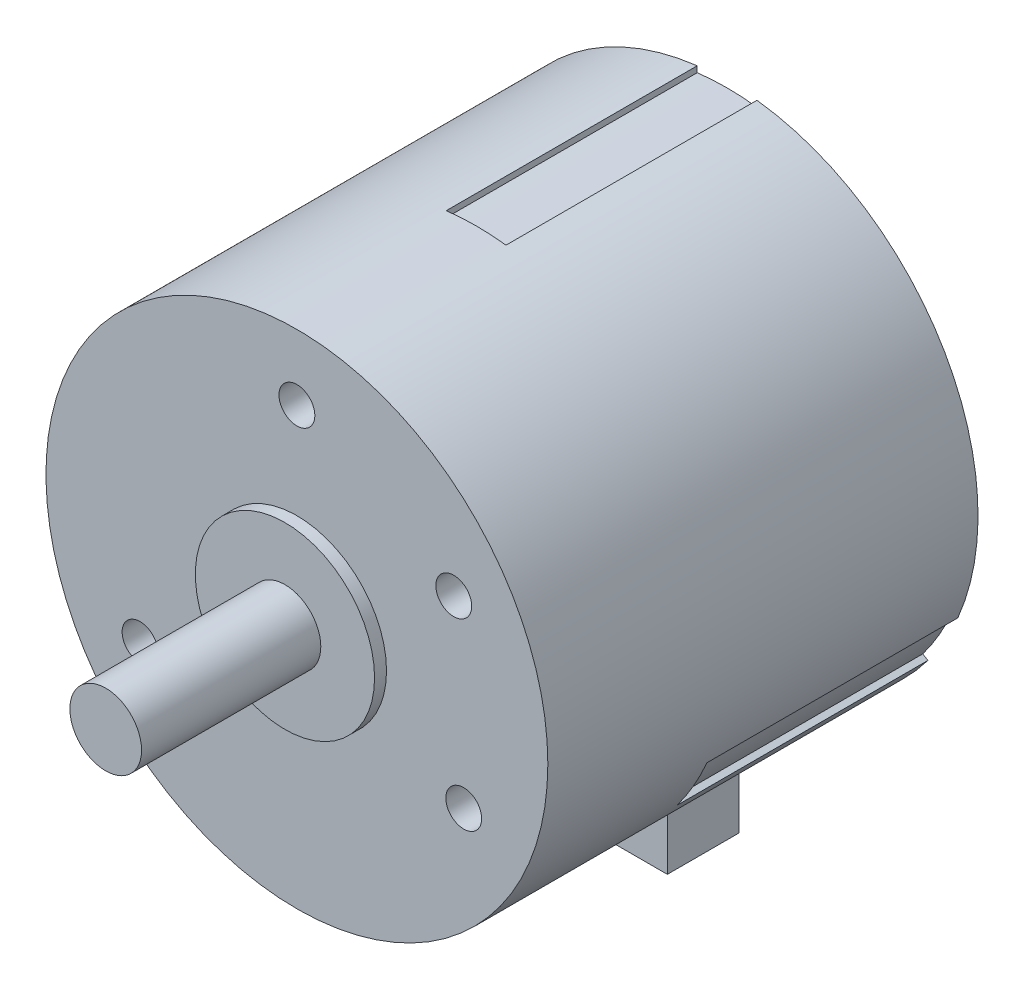
ISO-10303-21;
HEADER;
FILE_DESCRIPTION(('STEP AP214'),'2;1');
FILE_NAME('part.step','',(''),(''),'','','');
FILE_SCHEMA(('AUTOMOTIVE_DESIGN { 1 0 10303 214 1 1 1 1 }'));
ENDSEC;
DATA;
#1=APPLICATION_CONTEXT('core data for automotive mechanical design processes');
#2=APPLICATION_PROTOCOL_DEFINITION('international standard','automotive_design',2000,#1);
#3=PRODUCT_CONTEXT('',#1,'mechanical');
#4=PRODUCT('Part','Part','',(#3));
#5=PRODUCT_RELATED_PRODUCT_CATEGORY('part','',(#4));
#6=PRODUCT_DEFINITION_FORMATION('','',#4);
#7=PRODUCT_DEFINITION_CONTEXT('part definition',#1,'design');
#8=PRODUCT_DEFINITION('design','',#6,#7);
#9=PRODUCT_DEFINITION_SHAPE('','',#8);
#10=(LENGTH_UNIT() NAMED_UNIT(*) SI_UNIT(.MILLI.,.METRE.));
#11=(NAMED_UNIT(*) PLANE_ANGLE_UNIT() SI_UNIT($,.RADIAN.));
#12=(NAMED_UNIT(*) SI_UNIT($,.STERADIAN.) SOLID_ANGLE_UNIT());
#13=UNCERTAINTY_MEASURE_WITH_UNIT(LENGTH_MEASURE(1.E-05),#10,'distance_accuracy_value','');
#14=(GEOMETRIC_REPRESENTATION_CONTEXT(3) GLOBAL_UNCERTAINTY_ASSIGNED_CONTEXT((#13)) GLOBAL_UNIT_ASSIGNED_CONTEXT((#10,
#11,#12)) REPRESENTATION_CONTEXT('',''));
#15=CARTESIAN_POINT('',(0.,0.,0.));
#16=DIRECTION('',(0.,0.,1.));
#17=DIRECTION('',(1.,0.,0.));
#18=AXIS2_PLACEMENT_3D('',#15,#16,#17);
#19=CARTESIAN_POINT('',(0.,0.,0.));
#20=DIRECTION('',(0.,0.,1.));
#21=DIRECTION('',(1.,0.,0.));
#22=AXIS2_PLACEMENT_3D('',#19,#20,#21);
#23=PLANE('',#22);
#24=DIRECTION('',(-0.866025403784439,-0.499999999999999,0.));
#25=VECTOR('',#24,1.);
#26=CARTESIAN_POINT('',(-19.3072007797444,-8.26026622153542,0.));
#27=LINE('',#26,#25);
#28=CARTESIAN_POINT('',(-18.8710101867061,-8.00843146522681,0.));
#29=VERTEX_POINT('',#28);
#30=CARTESIAN_POINT('',(-19.3072007797444,-8.26026622153542,0.));
#31=VERTEX_POINT('',#30);
#32=EDGE_CURVE('E285',#29,#31,#27,.T.);
#33=ORIENTED_EDGE('',*,*,#32,.F.);
#34=CARTESIAN_POINT('',(0.,0.,0.));
#35=DIRECTION('',(0.,0.,-1.));
#36=DIRECTION('',(-1.,0.,0.));
#37=AXIS2_PLACEMENT_3D('',#34,#35,#36);
#38=CIRCLE('',#37,20.5);
#39=CARTESIAN_POINT('',(-16.3710101867061,-12.338558484149,0.));
#40=VERTEX_POINT('',#39);
#41=EDGE_CURVE('E314',#40,#29,#38,.T.);
#42=ORIENTED_EDGE('',*,*,#41,.F.);
#43=DIRECTION('',(0.866025403784439,0.499999999999999,0.));
#44=VECTOR('',#43,1.);
#45=CARTESIAN_POINT('',(-16.8072007797444,-12.5903932404576,0.));
#46=LINE('',#45,#44);
#47=CARTESIAN_POINT('',(-16.8072007797444,-12.5903932404576,0.));
#48=VERTEX_POINT('',#47);
#49=EDGE_CURVE('E311',#48,#40,#46,.T.);
#50=ORIENTED_EDGE('',*,*,#49,.F.);
#51=CARTESIAN_POINT('',(0.,0.,0.));
#52=DIRECTION('',(0.,0.,1.));
#53=DIRECTION('',(1.,0.,0.));
#54=AXIS2_PLACEMENT_3D('',#51,#52,#53);
#55=CIRCLE('',#54,21.);
#56=EDGE_CURVE('E362',#31,#48,#55,.T.);
#57=ORIENTED_EDGE('',*,*,#56,.F.);
#58=EDGE_LOOP('',(#33,#42,#50,#57));
#59=FACE_BOUND('',#58,.T.);
#60=ADVANCED_FACE('F35',(#59),#23,.F.);
#61=DIRECTION('',(0.,-1.,0.));
#62=VECTOR('',#61,1.);
#63=CARTESIAN_POINT('',(-15.,-13.9731886124821,0.));
#64=LINE('',#63,#62);
#65=CARTESIAN_POINT('',(-15.,-13.9731886124821,0.));
#66=VERTEX_POINT('',#65);
#67=CARTESIAN_POINT('',(-15.,-14.6969384566991,0.));
#68=VERTEX_POINT('',#67);
#69=EDGE_CURVE('E308',#66,#68,#64,.T.);
#70=ORIENTED_EDGE('',*,*,#69,.F.);
#71=CARTESIAN_POINT('',(0.,0.,0.));
#72=DIRECTION('',(0.,0.,-1.));
#73=DIRECTION('',(-1.,0.,0.));
#74=AXIS2_PLACEMENT_3D('',#71,#72,#73);
#75=CIRCLE('',#74,20.5);
#76=CARTESIAN_POINT('',(15.,-13.9731886124821,0.));
#77=VERTEX_POINT('',#76);
#78=EDGE_CURVE('E305',#77,#66,#75,.T.);
#79=ORIENTED_EDGE('',*,*,#78,.F.);
#80=DIRECTION('',(0.,1.,0.));
#81=VECTOR('',#80,1.);
#82=CARTESIAN_POINT('',(15.,-13.9731886124821,0.));
#83=LINE('',#82,#81);
#84=CARTESIAN_POINT('',(15.,-14.6969384566991,0.));
#85=VERTEX_POINT('',#84);
#86=EDGE_CURVE('E302',#85,#77,#83,.T.);
#87=ORIENTED_EDGE('',*,*,#86,.F.);
#88=EDGE_CURVE('E364',#68,#85,#55,.T.);
#89=ORIENTED_EDGE('',*,*,#88,.F.);
#90=EDGE_LOOP('',(#70,#79,#87,#89));
#91=FACE_BOUND('',#90,.T.);
#92=ADVANCED_FACE('F385',(#91),#23,.F.);
#93=DIRECTION('',(0.866025403784441,-0.499999999999997,0.));
#94=VECTOR('',#93,1.);
#95=CARTESIAN_POINT('',(16.8072007797443,-12.5903932404576,0.));
#96=LINE('',#95,#94);
#97=CARTESIAN_POINT('',(16.3710101867061,-12.338558484149,0.));
#98=VERTEX_POINT('',#97);
#99=CARTESIAN_POINT('',(16.8072007797443,-12.5903932404576,0.));
#100=VERTEX_POINT('',#99);
#101=EDGE_CURVE('E299',#98,#100,#96,.T.);
#102=ORIENTED_EDGE('',*,*,#101,.F.);
#103=CARTESIAN_POINT('',(0.,0.,0.));
#104=DIRECTION('',(0.,0.,-1.));
#105=DIRECTION('',(-1.,0.,0.));
#106=AXIS2_PLACEMENT_3D('',#103,#104,#105);
#107=CIRCLE('',#106,20.5);
#108=CARTESIAN_POINT('',(18.8710101867061,-8.00843146522682,0.));
#109=VERTEX_POINT('',#108);
#110=EDGE_CURVE('E296',#109,#98,#107,.T.);
#111=ORIENTED_EDGE('',*,*,#110,.F.);
#112=DIRECTION('',(-0.866025403784438,0.500000000000002,0.));
#113=VECTOR('',#112,1.);
#114=CARTESIAN_POINT('',(19.3072007797443,-8.26026622153543,0.));
#115=LINE('',#114,#113);
#116=CARTESIAN_POINT('',(19.3072007797443,-8.26026622153543,0.));
#117=VERTEX_POINT('',#116);
#118=EDGE_CURVE('E293',#117,#109,#115,.T.);
#119=ORIENTED_EDGE('',*,*,#118,.F.);
#120=EDGE_CURVE('E190',#100,#117,#55,.T.);
#121=ORIENTED_EDGE('',*,*,#120,.F.);
#122=EDGE_LOOP('',(#102,#111,#119,#121));
#123=FACE_BOUND('',#122,.T.);
#124=ADVANCED_FACE('F415',(#123),#23,.F.);
#125=DIRECTION('',(0.,1.,0.));
#126=VECTOR('',#125,1.);
#127=CARTESIAN_POINT('',(2.5,20.850659461993,0.));
#128=LINE('',#127,#126);
#129=CARTESIAN_POINT('',(2.5,20.3469899493758,0.));
#130=VERTEX_POINT('',#129);
#131=CARTESIAN_POINT('',(2.5,20.850659461993,0.));
#132=VERTEX_POINT('',#131);
#133=EDGE_CURVE('E290',#130,#132,#128,.T.);
#134=ORIENTED_EDGE('',*,*,#133,.F.);
#135=CARTESIAN_POINT('',(0.,0.,0.));
#136=DIRECTION('',(0.,0.,-1.));
#137=DIRECTION('',(-1.,0.,0.));
#138=AXIS2_PLACEMENT_3D('',#135,#136,#137);
#139=CIRCLE('',#138,20.5);
#140=CARTESIAN_POINT('',(-2.5,20.3469899493758,0.));
#141=VERTEX_POINT('',#140);
#142=EDGE_CURVE('E287',#141,#130,#139,.T.);
#143=ORIENTED_EDGE('',*,*,#142,.F.);
#144=DIRECTION('',(0.,-1.,0.));
#145=VECTOR('',#144,1.);
#146=CARTESIAN_POINT('',(-2.5,20.850659461993,0.));
#147=LINE('',#146,#145);
#148=CARTESIAN_POINT('',(-2.5,20.850659461993,0.));
#149=VERTEX_POINT('',#148);
#150=EDGE_CURVE('E281',#149,#141,#147,.T.);
#151=ORIENTED_EDGE('',*,*,#150,.F.);
#152=EDGE_CURVE('E39',#132,#149,#55,.T.);
#153=ORIENTED_EDGE('',*,*,#152,.F.);
#154=EDGE_LOOP('',(#134,#143,#151,#153));
#155=FACE_BOUND('',#154,.T.);
#156=ADVANCED_FACE('F411',(#155),#23,.F.);
#157=CARTESIAN_POINT('',(0.,0.,15.));
#158=DIRECTION('',(0.,0.,-1.));
#159=DIRECTION('',(-1.,0.,0.));
#160=AXIS2_PLACEMENT_3D('',#157,#158,#159);
#161=CYLINDRICAL_SURFACE('',#160,21.);
#162=DIRECTION('',(0.,0.,1.));
#163=VECTOR('',#162,1.);
#164=CARTESIAN_POINT('',(15.,-14.6969384566991,-6.));
#165=LINE('',#164,#163);
#166=CARTESIAN_POINT('',(15.,-14.6969384566991,-12.));
#167=VERTEX_POINT('',#166);
#168=EDGE_CURVE('E338',#167,#85,#165,.T.);
#169=ORIENTED_EDGE('',*,*,#168,.F.);
#170=CARTESIAN_POINT('',(0.,0.,-12.));
#171=DIRECTION('',(0.,0.,-1.));
#172=DIRECTION('',(-1.,0.,0.));
#173=AXIS2_PLACEMENT_3D('',#170,#171,#172);
#174=CIRCLE('',#173,21.);
#175=CARTESIAN_POINT('',(10.,-18.4661853126194,-12.));
#176=VERTEX_POINT('',#175);
#177=EDGE_CURVE('E207',#167,#176,#174,.T.);
#178=ORIENTED_EDGE('',*,*,#177,.T.);
#179=CARTESIAN_POINT('',(-10.,-18.4661853126194,-12.));
#180=VERTEX_POINT('',#179);
#181=EDGE_CURVE('E59',#176,#180,#174,.T.);
#182=ORIENTED_EDGE('',*,*,#181,.T.);
#183=CARTESIAN_POINT('',(-15.,-14.6969384566991,-12.));
#184=VERTEX_POINT('',#183);
#185=EDGE_CURVE('E210',#180,#184,#174,.T.);
#186=ORIENTED_EDGE('',*,*,#185,.T.);
#187=DIRECTION('',(0.,0.,1.));
#188=VECTOR('',#187,1.);
#189=CARTESIAN_POINT('',(-15.,-14.6969384566991,-6.));
#190=LINE('',#189,#188);
#191=EDGE_CURVE('E329',#184,#68,#190,.T.);
#192=ORIENTED_EDGE('',*,*,#191,.T.);
#193=ORIENTED_EDGE('',*,*,#88,.T.);
#194=EDGE_LOOP('',(#169,#178,#182,#186,#192,#193));
#195=FACE_BOUND('',#194,.T.);
#196=CARTESIAN_POINT('',(0.,0.,15.));
#197=DIRECTION('',(0.,0.,1.));
#198=DIRECTION('',(1.,0.,0.));
#199=AXIS2_PLACEMENT_3D('',#196,#197,#198);
#200=CIRCLE('',#199,21.);
#201=CARTESIAN_POINT('',(21.,0.,15.));
#202=VERTEX_POINT('',#201);
#203=EDGE_CURVE('E358',#202,#202,#200,.T.);
#204=ORIENTED_EDGE('',*,*,#203,.F.);
#205=EDGE_LOOP('',(#204));
#206=FACE_BOUND('',#205,.T.);
#207=ORIENTED_EDGE('',*,*,#152,.T.);
#208=DIRECTION('',(0.,0.,1.));
#209=VECTOR('',#208,1.);
#210=CARTESIAN_POINT('',(-2.5,20.850659461993,-6.));
#211=LINE('',#210,#209);
#212=CARTESIAN_POINT('',(-2.5,20.850659461993,-21.));
#213=VERTEX_POINT('',#212);
#214=EDGE_CURVE('E182',#213,#149,#211,.T.);
#215=ORIENTED_EDGE('',*,*,#214,.F.);
#216=CARTESIAN_POINT('',(0.,0.,-21.));
#217=DIRECTION('',(0.,0.,-1.));
#218=DIRECTION('',(-1.,0.,0.));
#219=AXIS2_PLACEMENT_3D('',#216,#217,#218);
#220=CIRCLE('',#219,21.);
#221=CARTESIAN_POINT('',(-19.3072007797444,-8.26026622153542,-21.));
#222=VERTEX_POINT('',#221);
#223=EDGE_CURVE('E186',#222,#213,#220,.T.);
#224=ORIENTED_EDGE('',*,*,#223,.F.);
#225=DIRECTION('',(0.,0.,1.));
#226=VECTOR('',#225,1.);
#227=CARTESIAN_POINT('',(-19.3072007797444,-8.26026622153542,-6.));
#228=LINE('',#227,#226);
#229=EDGE_CURVE('E284',#222,#31,#228,.T.);
#230=ORIENTED_EDGE('',*,*,#229,.T.);
#231=ORIENTED_EDGE('',*,*,#56,.T.);
#232=DIRECTION('',(0.,0.,1.));
#233=VECTOR('',#232,1.);
#234=CARTESIAN_POINT('',(-16.8072007797444,-12.5903932404576,-6.));
#235=LINE('',#234,#233);
#236=CARTESIAN_POINT('',(-16.8072007797444,-12.5903932404576,-21.));
#237=VERTEX_POINT('',#236);
#238=EDGE_CURVE('E326',#237,#48,#235,.T.);
#239=ORIENTED_EDGE('',*,*,#238,.F.);
#240=CARTESIAN_POINT('',(0.,0.,-21.));
#241=DIRECTION('',(0.,0.,-1.));
#242=DIRECTION('',(-1.,0.,0.));
#243=AXIS2_PLACEMENT_3D('',#240,#241,#242);
#244=CIRCLE('',#243,21.);
#245=CARTESIAN_POINT('',(16.8072007797443,-12.5903932404576,-21.));
#246=VERTEX_POINT('',#245);
#247=EDGE_CURVE('E231',#246,#237,#244,.T.);
#248=ORIENTED_EDGE('',*,*,#247,.F.);
#249=DIRECTION('',(0.,0.,1.));
#250=VECTOR('',#249,1.);
#251=CARTESIAN_POINT('',(16.8072007797443,-12.5903932404576,-6.));
#252=LINE('',#251,#250);
#253=EDGE_CURVE('E341',#246,#100,#252,.T.);
#254=ORIENTED_EDGE('',*,*,#253,.T.);
#255=ORIENTED_EDGE('',*,*,#120,.T.);
#256=DIRECTION('',(0.,0.,1.));
#257=VECTOR('',#256,1.);
#258=CARTESIAN_POINT('',(19.3072007797444,-8.26026622153543,-6.));
#259=LINE('',#258,#257);
#260=CARTESIAN_POINT('',(19.3072007797444,-8.26026622153543,-21.));
#261=VERTEX_POINT('',#260);
#262=EDGE_CURVE('E350',#261,#117,#259,.T.);
#263=ORIENTED_EDGE('',*,*,#262,.F.);
#264=CARTESIAN_POINT('',(0.,0.,-21.));
#265=DIRECTION('',(0.,0.,-1.));
#266=DIRECTION('',(-1.,0.,0.));
#267=AXIS2_PLACEMENT_3D('',#264,#265,#266);
#268=CIRCLE('',#267,21.);
#269=CARTESIAN_POINT('',(2.5,20.850659461993,-21.));
#270=VERTEX_POINT('',#269);
#271=EDGE_CURVE('E219',#270,#261,#268,.T.);
#272=ORIENTED_EDGE('',*,*,#271,.F.);
#273=DIRECTION('',(0.,0.,1.));
#274=VECTOR('',#273,1.);
#275=CARTESIAN_POINT('',(2.5,20.850659461993,-6.));
#276=LINE('',#275,#274);
#277=EDGE_CURVE('E353',#270,#132,#276,.T.);
#278=ORIENTED_EDGE('',*,*,#277,.T.);
#279=EDGE_LOOP('',(#207,#215,#224,#230,#231,#239,#248,#254,#255,#263,#272,#278));
#280=FACE_BOUND('',#279,.T.);
#281=ADVANCED_FACE('F37',(#195,#206,#280),#161,.T.);
#282=CARTESIAN_POINT('',(0.,0.,15.));
#283=DIRECTION('',(0.,0.,1.));
#284=DIRECTION('',(1.,0.,0.));
#285=AXIS2_PLACEMENT_3D('',#282,#283,#284);
#286=PLANE('',#285);
#287=CARTESIAN_POINT('',(0.,15.5,15.));
#288=DIRECTION('',(0.,0.,1.));
#289=DIRECTION('',(1.,0.,0.));
#290=AXIS2_PLACEMENT_3D('',#287,#288,#289);
#291=CIRCLE('',#290,1.5);
#292=CARTESIAN_POINT('',(1.5,15.5,15.));
#293=VERTEX_POINT('',#292);
#294=EDGE_CURVE('E486',#293,#293,#291,.T.);
#295=ORIENTED_EDGE('',*,*,#294,.F.);
#296=EDGE_LOOP('',(#295));
#297=FACE_BOUND('',#296,.T.);
#298=CARTESIAN_POINT('',(13.1270902899199,8.24193548387097,15.));
#299=DIRECTION('',(0.,0.,1.));
#300=DIRECTION('',(1.,0.,0.));
#301=AXIS2_PLACEMENT_3D('',#298,#299,#300);
#302=CIRCLE('',#301,1.5);
#303=CARTESIAN_POINT('',(14.6270902899199,8.24193548387097,15.));
#304=VERTEX_POINT('',#303);
#305=EDGE_CURVE('E490',#304,#304,#302,.T.);
#306=ORIENTED_EDGE('',*,*,#305,.F.);
#307=EDGE_LOOP('',(#306));
#308=FACE_BOUND('',#307,.T.);
#309=CARTESIAN_POINT('',(13.9603395174798,-6.73490315867208,15.));
#310=DIRECTION('',(0.,0.,1.));
#311=DIRECTION('',(1.,0.,0.));
#312=AXIS2_PLACEMENT_3D('',#309,#310,#311);
#313=CIRCLE('',#312,1.5);
#314=CARTESIAN_POINT('',(15.4603395174798,-6.73490315867208,15.));
#315=VERTEX_POINT('',#314);
#316=EDGE_CURVE('E494',#315,#315,#313,.T.);
#317=ORIENTED_EDGE('',*,*,#316,.F.);
#318=EDGE_LOOP('',(#317));
#319=FACE_BOUND('',#318,.T.);
#320=CARTESIAN_POINT('',(-13.1270902899198,-8.24193548387083,15.));
#321=DIRECTION('',(0.,0.,1.));
#322=DIRECTION('',(1.,0.,0.));
#323=AXIS2_PLACEMENT_3D('',#320,#321,#322);
#324=CIRCLE('',#323,1.5);
#325=CARTESIAN_POINT('',(-11.6270902899198,-8.24193548387083,15.));
#326=VERTEX_POINT('',#325);
#327=EDGE_CURVE('E498',#326,#326,#324,.T.);
#328=ORIENTED_EDGE('',*,*,#327,.F.);
#329=EDGE_LOOP('',(#328));
#330=FACE_BOUND('',#329,.T.);
#331=CARTESIAN_POINT('',(0.,0.,15.));
#332=DIRECTION('',(0.,0.,1.));
#333=DIRECTION('',(1.,0.,0.));
#334=AXIS2_PLACEMENT_3D('',#331,#332,#333);
#335=CIRCLE('',#334,7.5);
#336=CARTESIAN_POINT('',(7.5,0.,15.));
#337=VERTEX_POINT('',#336);
#338=EDGE_CURVE('E44',#337,#337,#335,.T.);
#339=ORIENTED_EDGE('',*,*,#338,.F.);
#340=EDGE_LOOP('',(#339));
#341=FACE_BOUND('',#340,.T.);
#342=ORIENTED_EDGE('',*,*,#203,.T.);
#343=EDGE_LOOP('',(#342));
#344=FACE_BOUND('',#343,.T.);
#345=ADVANCED_FACE('F423',(#297,#308,#319,#330,#341,#344),#286,.T.);
#346=CARTESIAN_POINT('',(-2.5,20.850659461993,-6.));
#347=DIRECTION('',(-1.,0.,0.));
#348=DIRECTION('',(0.,0.,1.));
#349=AXIS2_PLACEMENT_3D('',#346,#347,#348);
#350=PLANE('',#349);
#351=ORIENTED_EDGE('',*,*,#150,.T.);
#352=DIRECTION('',(0.,0.,1.));
#353=VECTOR('',#352,1.);
#354=CARTESIAN_POINT('',(-2.5,20.3469899493758,-6.));
#355=LINE('',#354,#353);
#356=CARTESIAN_POINT('',(-2.5,20.3469899493758,-21.));
#357=VERTEX_POINT('',#356);
#358=EDGE_CURVE('E191',#357,#141,#355,.T.);
#359=ORIENTED_EDGE('',*,*,#358,.F.);
#360=DIRECTION('',(0.,-1.,0.));
#361=VECTOR('',#360,1.);
#362=CARTESIAN_POINT('',(-2.5,20.850659461993,-21.));
#363=LINE('',#362,#361);
#364=EDGE_CURVE('E194',#213,#357,#363,.T.);
#365=ORIENTED_EDGE('',*,*,#364,.F.);
#366=ORIENTED_EDGE('',*,*,#214,.T.);
#367=EDGE_LOOP('',(#351,#359,#365,#366));
#368=FACE_BOUND('',#367,.T.);
#369=ADVANCED_FACE('F195',(#368),#350,.F.);
#370=CARTESIAN_POINT('',(0.,0.,-6.));
#371=DIRECTION('',(0.,0.,1.));
#372=DIRECTION('',(1.,0.,0.));
#373=AXIS2_PLACEMENT_3D('',#370,#371,#372);
#374=CYLINDRICAL_SURFACE('',#373,20.5);
#375=ORIENTED_EDGE('',*,*,#142,.T.);
#376=DIRECTION('',(0.,0.,1.));
#377=VECTOR('',#376,1.);
#378=CARTESIAN_POINT('',(2.5,20.3469899493758,-6.));
#379=LINE('',#378,#377);
#380=CARTESIAN_POINT('',(2.5,20.3469899493758,-21.));
#381=VERTEX_POINT('',#380);
#382=EDGE_CURVE('E355',#381,#130,#379,.T.);
#383=ORIENTED_EDGE('',*,*,#382,.F.);
#384=CARTESIAN_POINT('',(0.,0.,-21.));
#385=DIRECTION('',(0.,0.,-1.));
#386=DIRECTION('',(-1.,0.,0.));
#387=AXIS2_PLACEMENT_3D('',#384,#385,#386);
#388=CIRCLE('',#387,20.5);
#389=EDGE_CURVE('E200',#357,#381,#388,.T.);
#390=ORIENTED_EDGE('',*,*,#389,.F.);
#391=ORIENTED_EDGE('',*,*,#358,.T.);
#392=EDGE_LOOP('',(#375,#383,#390,#391));
#393=FACE_BOUND('',#392,.T.);
#394=ADVANCED_FACE('F427',(#393),#374,.T.);
#395=CARTESIAN_POINT('',(2.5,20.850659461993,-6.));
#396=DIRECTION('',(1.,0.,0.));
#397=DIRECTION('',(0.,0.,-1.));
#398=AXIS2_PLACEMENT_3D('',#395,#396,#397);
#399=PLANE('',#398);
#400=ORIENTED_EDGE('',*,*,#133,.T.);
#401=ORIENTED_EDGE('',*,*,#277,.F.);
#402=DIRECTION('',(0.,1.,0.));
#403=VECTOR('',#402,1.);
#404=CARTESIAN_POINT('',(2.5,20.3469899493758,-21.));
#405=LINE('',#404,#403);
#406=EDGE_CURVE('E216',#381,#270,#405,.T.);
#407=ORIENTED_EDGE('',*,*,#406,.F.);
#408=ORIENTED_EDGE('',*,*,#382,.T.);
#409=EDGE_LOOP('',(#400,#401,#407,#408));
#410=FACE_BOUND('',#409,.T.);
#411=ADVANCED_FACE('F429',(#410),#399,.F.);
#412=CARTESIAN_POINT('',(19.3072007797443,-8.26026622153543,-6.));
#413=DIRECTION('',(0.500000000000002,0.866025403784438,0.));
#414=DIRECTION('',(-0.866025403784438,0.500000000000002,0.));
#415=AXIS2_PLACEMENT_3D('',#412,#413,#414);
#416=PLANE('',#415);
#417=ORIENTED_EDGE('',*,*,#118,.T.);
#418=DIRECTION('',(0.,0.,1.));
#419=VECTOR('',#418,1.);
#420=CARTESIAN_POINT('',(18.8710101867061,-8.00843146522682,-6.));
#421=LINE('',#420,#419);
#422=CARTESIAN_POINT('',(18.8710101867061,-8.0084314652268,-21.));
#423=VERTEX_POINT('',#422);
#424=EDGE_CURVE('E347',#423,#109,#421,.T.);
#425=ORIENTED_EDGE('',*,*,#424,.F.);
#426=DIRECTION('',(-0.866025403784434,0.500000000000007,0.));
#427=VECTOR('',#426,1.);
#428=CARTESIAN_POINT('',(19.3072007797444,-8.26026622153543,-21.));
#429=LINE('',#428,#427);
#430=EDGE_CURVE('E222',#261,#423,#429,.T.);
#431=ORIENTED_EDGE('',*,*,#430,.F.);
#432=ORIENTED_EDGE('',*,*,#262,.T.);
#433=EDGE_LOOP('',(#417,#425,#431,#432));
#434=FACE_BOUND('',#433,.T.);
#435=ADVANCED_FACE('F433',(#434),#416,.F.);
#436=CARTESIAN_POINT('',(0.,0.,-6.));
#437=DIRECTION('',(0.,0.,1.));
#438=DIRECTION('',(1.,0.,0.));
#439=AXIS2_PLACEMENT_3D('',#436,#437,#438);
#440=CYLINDRICAL_SURFACE('',#439,20.5);
#441=ORIENTED_EDGE('',*,*,#110,.T.);
#442=DIRECTION('',(0.,0.,1.));
#443=VECTOR('',#442,1.);
#444=CARTESIAN_POINT('',(16.3710101867061,-12.338558484149,-6.));
#445=LINE('',#444,#443);
#446=CARTESIAN_POINT('',(16.3710101867061,-12.338558484149,-21.));
#447=VERTEX_POINT('',#446);
#448=EDGE_CURVE('E344',#447,#98,#445,.T.);
#449=ORIENTED_EDGE('',*,*,#448,.F.);
#450=CARTESIAN_POINT('',(0.,0.,-21.));
#451=DIRECTION('',(0.,0.,-1.));
#452=DIRECTION('',(-1.,0.,0.));
#453=AXIS2_PLACEMENT_3D('',#450,#451,#452);
#454=CIRCLE('',#453,20.5);
#455=EDGE_CURVE('E225',#423,#447,#454,.T.);
#456=ORIENTED_EDGE('',*,*,#455,.F.);
#457=ORIENTED_EDGE('',*,*,#424,.T.);
#458=EDGE_LOOP('',(#441,#449,#456,#457));
#459=FACE_BOUND('',#458,.T.);
#460=ADVANCED_FACE('F437',(#459),#440,.T.);
#461=CARTESIAN_POINT('',(16.8072007797443,-12.5903932404576,-6.));
#462=DIRECTION('',(-0.499999999999997,-0.866025403784441,0.));
#463=DIRECTION('',(0.866025403784441,-0.499999999999997,0.));
#464=AXIS2_PLACEMENT_3D('',#461,#462,#463);
#465=PLANE('',#464);
#466=ORIENTED_EDGE('',*,*,#101,.T.);
#467=ORIENTED_EDGE('',*,*,#253,.F.);
#468=DIRECTION('',(0.866025403784439,-0.5,0.));
#469=VECTOR('',#468,1.);
#470=CARTESIAN_POINT('',(16.3710101867061,-12.338558484149,-21.));
#471=LINE('',#470,#469);
#472=EDGE_CURVE('E228',#447,#246,#471,.T.);
#473=ORIENTED_EDGE('',*,*,#472,.F.);
#474=ORIENTED_EDGE('',*,*,#448,.T.);
#475=EDGE_LOOP('',(#466,#467,#473,#474));
#476=FACE_BOUND('',#475,.T.);
#477=ADVANCED_FACE('F439',(#476),#465,.F.);
#478=CARTESIAN_POINT('',(15.,-13.9731886124821,-6.));
#479=DIRECTION('',(1.,0.,0.));
#480=DIRECTION('',(0.,0.,-1.));
#481=AXIS2_PLACEMENT_3D('',#478,#479,#480);
#482=PLANE('',#481);
#483=ORIENTED_EDGE('',*,*,#86,.T.);
#484=DIRECTION('',(0.,0.,1.));
#485=VECTOR('',#484,1.);
#486=CARTESIAN_POINT('',(15.,-13.9731886124821,-6.));
#487=LINE('',#486,#485);
#488=CARTESIAN_POINT('',(15.,-13.9731886124821,-12.));
#489=VERTEX_POINT('',#488);
#490=EDGE_CURVE('E335',#489,#77,#487,.T.);
#491=ORIENTED_EDGE('',*,*,#490,.F.);
#492=DIRECTION('',(0.,1.,0.));
#493=VECTOR('',#492,1.);
#494=CARTESIAN_POINT('',(15.,-14.6969384566991,-12.));
#495=LINE('',#494,#493);
#496=EDGE_CURVE('E243',#167,#489,#495,.T.);
#497=ORIENTED_EDGE('',*,*,#496,.F.);
#498=ORIENTED_EDGE('',*,*,#168,.T.);
#499=EDGE_LOOP('',(#483,#491,#497,#498));
#500=FACE_BOUND('',#499,.T.);
#501=ADVANCED_FACE('F372',(#500),#482,.F.);
#502=CARTESIAN_POINT('',(0.,0.,-6.));
#503=DIRECTION('',(0.,0.,1.));
#504=DIRECTION('',(1.,0.,0.));
#505=AXIS2_PLACEMENT_3D('',#502,#503,#504);
#506=CYLINDRICAL_SURFACE('',#505,20.5);
#507=ORIENTED_EDGE('',*,*,#78,.T.);
#508=DIRECTION('',(0.,0.,1.));
#509=VECTOR('',#508,1.);
#510=CARTESIAN_POINT('',(-15.,-13.9731886124821,-6.));
#511=LINE('',#510,#509);
#512=CARTESIAN_POINT('',(-15.,-13.9731886124821,-12.));
#513=VERTEX_POINT('',#512);
#514=EDGE_CURVE('E332',#513,#66,#511,.T.);
#515=ORIENTED_EDGE('',*,*,#514,.F.);
#516=CARTESIAN_POINT('',(0.,0.,-12.));
#517=DIRECTION('',(0.,0.,-1.));
#518=DIRECTION('',(-1.,0.,0.));
#519=AXIS2_PLACEMENT_3D('',#516,#517,#518);
#520=CIRCLE('',#519,20.5);
#521=CARTESIAN_POINT('',(-10.,-17.8955301681733,-12.));
#522=VERTEX_POINT('',#521);
#523=EDGE_CURVE('E258',#522,#513,#520,.T.);
#524=ORIENTED_EDGE('',*,*,#523,.F.);
#525=DIRECTION('',(0.,0.,1.));
#526=VECTOR('',#525,1.);
#527=CARTESIAN_POINT('',(-10.,-17.8955301681733,-12.));
#528=LINE('',#527,#526);
#529=CARTESIAN_POINT('',(-10.,-17.8955301681733,-6.));
#530=VERTEX_POINT('',#529);
#531=EDGE_CURVE('E264',#522,#530,#528,.T.);
#532=ORIENTED_EDGE('',*,*,#531,.T.);
#533=CARTESIAN_POINT('',(0.,0.,-6.));
#534=DIRECTION('',(0.,0.,-1.));
#535=DIRECTION('',(-1.,0.,0.));
#536=AXIS2_PLACEMENT_3D('',#533,#534,#535);
#537=CIRCLE('',#536,20.5);
#538=CARTESIAN_POINT('',(10.,-17.8955301681733,-6.));
#539=VERTEX_POINT('',#538);
#540=EDGE_CURVE('E282',#539,#530,#537,.T.);
#541=ORIENTED_EDGE('',*,*,#540,.F.);
#542=DIRECTION('',(0.,0.,1.));
#543=VECTOR('',#542,1.);
#544=CARTESIAN_POINT('',(10.,-17.8955301681733,-12.));
#545=LINE('',#544,#543);
#546=CARTESIAN_POINT('',(10.,-17.8955301681733,-12.));
#547=VERTEX_POINT('',#546);
#548=EDGE_CURVE('E278',#547,#539,#545,.T.);
#549=ORIENTED_EDGE('',*,*,#548,.F.);
#550=CARTESIAN_POINT('',(0.,0.,-12.));
#551=DIRECTION('',(0.,0.,-1.));
#552=DIRECTION('',(-1.,0.,0.));
#553=AXIS2_PLACEMENT_3D('',#550,#551,#552);
#554=CIRCLE('',#553,20.5);
#555=EDGE_CURVE('E246',#489,#547,#554,.T.);
#556=ORIENTED_EDGE('',*,*,#555,.F.);
#557=ORIENTED_EDGE('',*,*,#490,.T.);
#558=EDGE_LOOP('',(#507,#515,#524,#532,#541,#549,#556,#557));
#559=FACE_BOUND('',#558,.T.);
#560=ADVANCED_FACE('F387',(#559),#506,.T.);
#561=CARTESIAN_POINT('',(-15.,-13.9731886124821,-6.));
#562=DIRECTION('',(-1.,0.,0.));
#563=DIRECTION('',(0.,0.,1.));
#564=AXIS2_PLACEMENT_3D('',#561,#562,#563);
#565=PLANE('',#564);
#566=ORIENTED_EDGE('',*,*,#69,.T.);
#567=ORIENTED_EDGE('',*,*,#191,.F.);
#568=DIRECTION('',(0.,-1.,0.));
#569=VECTOR('',#568,1.);
#570=CARTESIAN_POINT('',(-15.,-13.9731886124821,-12.));
#571=LINE('',#570,#569);
#572=EDGE_CURVE('E261',#513,#184,#571,.T.);
#573=ORIENTED_EDGE('',*,*,#572,.F.);
#574=ORIENTED_EDGE('',*,*,#514,.T.);
#575=EDGE_LOOP('',(#566,#567,#573,#574));
#576=FACE_BOUND('',#575,.T.);
#577=ADVANCED_FACE('F384',(#576),#565,.F.);
#578=CARTESIAN_POINT('',(-16.8072007797444,-12.5903932404576,-6.));
#579=DIRECTION('',(0.499999999999999,-0.866025403784439,0.));
#580=DIRECTION('',(0.866025403784439,0.499999999999999,0.));
#581=AXIS2_PLACEMENT_3D('',#578,#579,#580);
#582=PLANE('',#581);
#583=ORIENTED_EDGE('',*,*,#49,.T.);
#584=DIRECTION('',(0.,0.,1.));
#585=VECTOR('',#584,1.);
#586=CARTESIAN_POINT('',(-16.3710101867061,-12.338558484149,-6.));
#587=LINE('',#586,#585);
#588=CARTESIAN_POINT('',(-16.3710101867061,-12.338558484149,-21.));
#589=VERTEX_POINT('',#588);
#590=EDGE_CURVE('E323',#589,#40,#587,.T.);
#591=ORIENTED_EDGE('',*,*,#590,.F.);
#592=DIRECTION('',(0.866025403784439,0.5,0.));
#593=VECTOR('',#592,1.);
#594=CARTESIAN_POINT('',(-16.8072007797444,-12.5903932404576,-21.));
#595=LINE('',#594,#593);
#596=EDGE_CURVE('E234',#237,#589,#595,.T.);
#597=ORIENTED_EDGE('',*,*,#596,.F.);
#598=ORIENTED_EDGE('',*,*,#238,.T.);
#599=EDGE_LOOP('',(#583,#591,#597,#598));
#600=FACE_BOUND('',#599,.T.);
#601=ADVANCED_FACE('F443',(#600),#582,.F.);
#602=CARTESIAN_POINT('',(0.,0.,-6.));
#603=DIRECTION('',(0.,0.,1.));
#604=DIRECTION('',(1.,0.,0.));
#605=AXIS2_PLACEMENT_3D('',#602,#603,#604);
#606=CYLINDRICAL_SURFACE('',#605,20.5);
#607=ORIENTED_EDGE('',*,*,#41,.T.);
#608=DIRECTION('',(0.,0.,1.));
#609=VECTOR('',#608,1.);
#610=CARTESIAN_POINT('',(-18.8710101867061,-8.00843146522681,-6.));
#611=LINE('',#610,#609);
#612=CARTESIAN_POINT('',(-18.8710101867061,-8.0084314652268,-21.));
#613=VERTEX_POINT('',#612);
#614=EDGE_CURVE('E320',#613,#29,#611,.T.);
#615=ORIENTED_EDGE('',*,*,#614,.F.);
#616=CARTESIAN_POINT('',(0.,0.,-21.));
#617=DIRECTION('',(0.,0.,-1.));
#618=DIRECTION('',(-1.,0.,0.));
#619=AXIS2_PLACEMENT_3D('',#616,#617,#618);
#620=CIRCLE('',#619,20.5);
#621=EDGE_CURVE('E237',#589,#613,#620,.T.);
#622=ORIENTED_EDGE('',*,*,#621,.F.);
#623=ORIENTED_EDGE('',*,*,#590,.T.);
#624=EDGE_LOOP('',(#607,#615,#622,#623));
#625=FACE_BOUND('',#624,.T.);
#626=ADVANCED_FACE('F446',(#625),#606,.T.);
#627=CARTESIAN_POINT('',(-19.3072007797444,-8.26026622153542,-6.));
#628=DIRECTION('',(-0.499999999999999,0.866025403784439,0.));
#629=DIRECTION('',(-0.866025403784439,-0.499999999999999,0.));
#630=AXIS2_PLACEMENT_3D('',#627,#628,#629);
#631=PLANE('',#630);
#632=ORIENTED_EDGE('',*,*,#32,.T.);
#633=ORIENTED_EDGE('',*,*,#229,.F.);
#634=DIRECTION('',(-0.866025403784439,-0.499999999999999,0.));
#635=VECTOR('',#634,1.);
#636=CARTESIAN_POINT('',(-18.8710101867061,-8.0084314652268,-21.));
#637=LINE('',#636,#635);
#638=EDGE_CURVE('E206',#613,#222,#637,.T.);
#639=ORIENTED_EDGE('',*,*,#638,.F.);
#640=ORIENTED_EDGE('',*,*,#614,.T.);
#641=EDGE_LOOP('',(#632,#633,#639,#640));
#642=FACE_BOUND('',#641,.T.);
#643=ADVANCED_FACE('F448',(#642),#631,.F.);
#644=CARTESIAN_POINT('',(0.,0.,-6.));
#645=DIRECTION('',(0.,0.,-1.));
#646=DIRECTION('',(-1.,0.,0.));
#647=AXIS2_PLACEMENT_3D('',#644,#645,#646);
#648=PLANE('',#647);
#649=DIRECTION('',(0.,-1.,0.));
#650=VECTOR('',#649,1.);
#651=CARTESIAN_POINT('',(10.,-17.8955301681733,-6.));
#652=LINE('',#651,#650);
#653=CARTESIAN_POINT('',(10.,-24.,-6.));
#654=VERTEX_POINT('',#653);
#655=EDGE_CURVE('E239',#539,#654,#652,.T.);
#656=ORIENTED_EDGE('',*,*,#655,.F.);
#657=ORIENTED_EDGE('',*,*,#540,.T.);
#658=DIRECTION('',(0.,1.,0.));
#659=VECTOR('',#658,1.);
#660=CARTESIAN_POINT('',(-10.,-17.8955301681733,-6.));
#661=LINE('',#660,#659);
#662=CARTESIAN_POINT('',(-10.,-24.,-6.));
#663=VERTEX_POINT('',#662);
#664=EDGE_CURVE('E247',#663,#530,#661,.T.);
#665=ORIENTED_EDGE('',*,*,#664,.F.);
#666=DIRECTION('',(-1.,0.,0.));
#667=VECTOR('',#666,1.);
#668=CARTESIAN_POINT('',(10.,-24.,-6.));
#669=LINE('',#668,#667);
#670=EDGE_CURVE('E266',#654,#663,#669,.T.);
#671=ORIENTED_EDGE('',*,*,#670,.F.);
#672=EDGE_LOOP('',(#656,#657,#665,#671));
#673=FACE_BOUND('',#672,.T.);
#674=ADVANCED_FACE('F450',(#673),#648,.F.);
#675=CARTESIAN_POINT('',(10.,-17.8955301681733,-12.));
#676=DIRECTION('',(-1.,0.,0.));
#677=DIRECTION('',(0.,0.,1.));
#678=AXIS2_PLACEMENT_3D('',#675,#676,#677);
#679=PLANE('',#678);
#680=ORIENTED_EDGE('',*,*,#655,.T.);
#681=DIRECTION('',(0.,0.,1.));
#682=VECTOR('',#681,1.);
#683=CARTESIAN_POINT('',(10.,-24.,-12.));
#684=LINE('',#683,#682);
#685=CARTESIAN_POINT('',(10.,-24.,-12.));
#686=VERTEX_POINT('',#685);
#687=EDGE_CURVE('E275',#686,#654,#684,.T.);
#688=ORIENTED_EDGE('',*,*,#687,.F.);
#689=DIRECTION('',(0.,-1.,0.));
#690=VECTOR('',#689,1.);
#691=CARTESIAN_POINT('',(10.,-17.8955301681733,-12.));
#692=LINE('',#691,#690);
#693=EDGE_CURVE('E250',#176,#686,#692,.T.);
#694=ORIENTED_EDGE('',*,*,#693,.F.);
#695=EDGE_CURVE('E251',#547,#176,#692,.T.);
#696=ORIENTED_EDGE('',*,*,#695,.F.);
#697=ORIENTED_EDGE('',*,*,#548,.T.);
#698=EDGE_LOOP('',(#680,#688,#694,#696,#697));
#699=FACE_BOUND('',#698,.T.);
#700=ADVANCED_FACE('F390',(#699),#679,.F.);
#701=CARTESIAN_POINT('',(10.,-24.,-12.));
#702=DIRECTION('',(0.,1.,0.));
#703=DIRECTION('',(0.,0.,1.));
#704=AXIS2_PLACEMENT_3D('',#701,#702,#703);
#705=PLANE('',#704);
#706=ORIENTED_EDGE('',*,*,#670,.T.);
#707=DIRECTION('',(0.,0.,1.));
#708=VECTOR('',#707,1.);
#709=CARTESIAN_POINT('',(-10.,-24.,-12.));
#710=LINE('',#709,#708);
#711=CARTESIAN_POINT('',(-10.,-24.,-12.));
#712=VERTEX_POINT('',#711);
#713=EDGE_CURVE('E272',#712,#663,#710,.T.);
#714=ORIENTED_EDGE('',*,*,#713,.F.);
#715=DIRECTION('',(-1.,0.,0.));
#716=VECTOR('',#715,1.);
#717=CARTESIAN_POINT('',(10.,-24.,-12.));
#718=LINE('',#717,#716);
#719=EDGE_CURVE('E254',#686,#712,#718,.T.);
#720=ORIENTED_EDGE('',*,*,#719,.F.);
#721=ORIENTED_EDGE('',*,*,#687,.T.);
#722=EDGE_LOOP('',(#706,#714,#720,#721));
#723=FACE_BOUND('',#722,.T.);
#724=ADVANCED_FACE('F396',(#723),#705,.F.);
#725=CARTESIAN_POINT('',(-10.,-17.8955301681733,-12.));
#726=DIRECTION('',(1.,0.,0.));
#727=DIRECTION('',(0.,0.,-1.));
#728=AXIS2_PLACEMENT_3D('',#725,#726,#727);
#729=PLANE('',#728);
#730=ORIENTED_EDGE('',*,*,#664,.T.);
#731=ORIENTED_EDGE('',*,*,#531,.F.);
#732=DIRECTION('',(0.,1.,0.));
#733=VECTOR('',#732,1.);
#734=CARTESIAN_POINT('',(-10.,-17.8955301681733,-12.));
#735=LINE('',#734,#733);
#736=EDGE_CURVE('E52',#180,#522,#735,.T.);
#737=ORIENTED_EDGE('',*,*,#736,.F.);
#738=EDGE_CURVE('E256',#712,#180,#735,.T.);
#739=ORIENTED_EDGE('',*,*,#738,.F.);
#740=ORIENTED_EDGE('',*,*,#713,.T.);
#741=EDGE_LOOP('',(#730,#731,#737,#739,#740));
#742=FACE_BOUND('',#741,.T.);
#743=ADVANCED_FACE('F399',(#742),#729,.F.);
#744=CARTESIAN_POINT('',(0.,0.,-12.));
#745=DIRECTION('',(0.,0.,-1.));
#746=DIRECTION('',(-1.,0.,0.));
#747=AXIS2_PLACEMENT_3D('',#744,#745,#746);
#748=PLANE('',#747);
#749=ORIENTED_EDGE('',*,*,#181,.F.);
#750=ORIENTED_EDGE('',*,*,#693,.T.);
#751=ORIENTED_EDGE('',*,*,#719,.T.);
#752=ORIENTED_EDGE('',*,*,#738,.T.);
#753=EDGE_LOOP('',(#749,#750,#751,#752));
#754=FACE_BOUND('',#753,.T.);
#755=ADVANCED_FACE('F393',(#754),#748,.T.);
#756=CARTESIAN_POINT('',(0.,0.,-12.));
#757=DIRECTION('',(0.,0.,-1.));
#758=DIRECTION('',(-1.,0.,0.));
#759=AXIS2_PLACEMENT_3D('',#756,#757,#758);
#760=PLANE('',#759);
#761=ORIENTED_EDGE('',*,*,#177,.F.);
#762=ORIENTED_EDGE('',*,*,#496,.T.);
#763=ORIENTED_EDGE('',*,*,#555,.T.);
#764=ORIENTED_EDGE('',*,*,#695,.T.);
#765=EDGE_LOOP('',(#761,#762,#763,#764));
#766=FACE_BOUND('',#765,.T.);
#767=ADVANCED_FACE('F376',(#766),#760,.F.);
#768=ORIENTED_EDGE('',*,*,#185,.F.);
#769=ORIENTED_EDGE('',*,*,#736,.T.);
#770=ORIENTED_EDGE('',*,*,#523,.T.);
#771=ORIENTED_EDGE('',*,*,#572,.T.);
#772=EDGE_LOOP('',(#768,#769,#770,#771));
#773=FACE_BOUND('',#772,.T.);
#774=ADVANCED_FACE('F380',(#773),#760,.F.);
#775=CARTESIAN_POINT('',(0.,0.,-21.));
#776=DIRECTION('',(0.,0.,-1.));
#777=DIRECTION('',(-1.,0.,0.));
#778=AXIS2_PLACEMENT_3D('',#775,#776,#777);
#779=PLANE('',#778);
#780=ORIENTED_EDGE('',*,*,#223,.T.);
#781=ORIENTED_EDGE('',*,*,#364,.T.);
#782=ORIENTED_EDGE('',*,*,#389,.T.);
#783=ORIENTED_EDGE('',*,*,#406,.T.);
#784=ORIENTED_EDGE('',*,*,#271,.T.);
#785=ORIENTED_EDGE('',*,*,#430,.T.);
#786=ORIENTED_EDGE('',*,*,#455,.T.);
#787=ORIENTED_EDGE('',*,*,#472,.T.);
#788=ORIENTED_EDGE('',*,*,#247,.T.);
#789=ORIENTED_EDGE('',*,*,#596,.T.);
#790=ORIENTED_EDGE('',*,*,#621,.T.);
#791=ORIENTED_EDGE('',*,*,#638,.T.);
#792=EDGE_LOOP('',(#780,#781,#782,#783,#784,#785,#786,#787,#788,#789,#790,#791));
#793=FACE_BOUND('',#792,.T.);
#794=ADVANCED_FACE('F203',(#793),#779,.T.);
#795=CARTESIAN_POINT('',(0.,0.,16.));
#796=DIRECTION('',(0.,0.,-1.));
#797=DIRECTION('',(-1.,0.,0.));
#798=AXIS2_PLACEMENT_3D('',#795,#796,#797);
#799=CYLINDRICAL_SURFACE('',#798,7.5);
#800=CARTESIAN_POINT('',(0.,0.,16.));
#801=DIRECTION('',(0.,0.,1.));
#802=DIRECTION('',(1.,0.,0.));
#803=AXIS2_PLACEMENT_3D('',#800,#801,#802);
#804=CIRCLE('',#803,7.5);
#805=CARTESIAN_POINT('',(7.5,0.,16.));
#806=VERTEX_POINT('',#805);
#807=EDGE_CURVE('E242',#806,#806,#804,.T.);
#808=ORIENTED_EDGE('',*,*,#807,.F.);
#809=EDGE_LOOP('',(#808));
#810=FACE_BOUND('',#809,.T.);
#811=ORIENTED_EDGE('',*,*,#338,.T.);
#812=EDGE_LOOP('',(#811));
#813=FACE_BOUND('',#812,.T.);
#814=ADVANCED_FACE('F502',(#810,#813),#799,.T.);
#815=CARTESIAN_POINT('',(0.,0.,16.));
#816=DIRECTION('',(0.,0.,1.));
#817=DIRECTION('',(1.,0.,0.));
#818=AXIS2_PLACEMENT_3D('',#815,#816,#817);
#819=PLANE('',#818);
#820=CARTESIAN_POINT('',(0.,0.,16.));
#821=DIRECTION('',(0.,0.,1.));
#822=DIRECTION('',(1.,0.,0.));
#823=AXIS2_PLACEMENT_3D('',#820,#821,#822);
#824=CIRCLE('',#823,3.);
#825=CARTESIAN_POINT('',(3.,0.,16.));
#826=VERTEX_POINT('',#825);
#827=EDGE_CURVE('E11',#826,#826,#824,.T.);
#828=ORIENTED_EDGE('',*,*,#827,.F.);
#829=EDGE_LOOP('',(#828));
#830=FACE_BOUND('',#829,.T.);
#831=ORIENTED_EDGE('',*,*,#807,.T.);
#832=EDGE_LOOP('',(#831));
#833=FACE_BOUND('',#832,.T.);
#834=ADVANCED_FACE('F504',(#830,#833),#819,.T.);
#835=CARTESIAN_POINT('',(0.,0.,31.));
#836=DIRECTION('',(0.,0.,-1.));
#837=DIRECTION('',(-1.,0.,0.));
#838=AXIS2_PLACEMENT_3D('',#835,#836,#837);
#839=CYLINDRICAL_SURFACE('',#838,3.);
#840=CARTESIAN_POINT('',(0.,0.,31.));
#841=DIRECTION('',(0.,0.,1.));
#842=DIRECTION('',(1.,0.,0.));
#843=AXIS2_PLACEMENT_3D('',#840,#841,#842);
#844=CIRCLE('',#843,3.);
#845=CARTESIAN_POINT('',(3.,0.,31.));
#846=VERTEX_POINT('',#845);
#847=EDGE_CURVE('E649',#846,#846,#844,.T.);
#848=ORIENTED_EDGE('',*,*,#847,.F.);
#849=EDGE_LOOP('',(#848));
#850=FACE_BOUND('',#849,.T.);
#851=ORIENTED_EDGE('',*,*,#827,.T.);
#852=EDGE_LOOP('',(#851));
#853=FACE_BOUND('',#852,.T.);
#854=ADVANCED_FACE('F511',(#850,#853),#839,.T.);
#855=CARTESIAN_POINT('',(0.,0.,31.));
#856=DIRECTION('',(0.,0.,1.));
#857=DIRECTION('',(1.,0.,0.));
#858=AXIS2_PLACEMENT_3D('',#855,#856,#857);
#859=PLANE('',#858);
#860=ORIENTED_EDGE('',*,*,#847,.T.);
#861=EDGE_LOOP('',(#860));
#862=FACE_BOUND('',#861,.T.);
#863=ADVANCED_FACE('F547',(#862),#859,.T.);
#864=CARTESIAN_POINT('',(-13.1270902899198,-8.24193548387083,12.));
#865=DIRECTION('',(0.,0.,1.));
#866=DIRECTION('',(1.,0.,0.));
#867=AXIS2_PLACEMENT_3D('',#864,#865,#866);
#868=CYLINDRICAL_SURFACE('',#867,1.5);
#869=CARTESIAN_POINT('',(-13.1270902899198,-8.24193548387083,12.));
#870=DIRECTION('',(0.,0.,1.));
#871=DIRECTION('',(1.,0.,0.));
#872=AXIS2_PLACEMENT_3D('',#869,#870,#871);
#873=CIRCLE('',#872,1.5);
#874=CARTESIAN_POINT('',(-11.6270902899198,-8.24193548387083,12.));
#875=VERTEX_POINT('',#874);
#876=EDGE_CURVE('E663',#875,#875,#873,.T.);
#877=ORIENTED_EDGE('',*,*,#876,.F.);
#878=EDGE_LOOP('',(#877));
#879=FACE_BOUND('',#878,.T.);
#880=ORIENTED_EDGE('',*,*,#327,.T.);
#881=EDGE_LOOP('',(#880));
#882=FACE_BOUND('',#881,.T.);
#883=ADVANCED_FACE('F555',(#879,#882),#868,.F.);
#884=CARTESIAN_POINT('',(-13.1270902899198,-8.24193548387083,12.));
#885=DIRECTION('',(0.,0.,1.));
#886=DIRECTION('',(1.,0.,0.));
#887=AXIS2_PLACEMENT_3D('',#884,#885,#886);
#888=PLANE('',#887);
#889=ORIENTED_EDGE('',*,*,#876,.T.);
#890=EDGE_LOOP('',(#889));
#891=FACE_BOUND('',#890,.T.);
#892=ADVANCED_FACE('F572',(#891),#888,.T.);
#893=CARTESIAN_POINT('',(13.9603395174798,-6.73490315867208,12.));
#894=DIRECTION('',(0.,0.,1.));
#895=DIRECTION('',(1.,0.,0.));
#896=AXIS2_PLACEMENT_3D('',#893,#894,#895);
#897=CYLINDRICAL_SURFACE('',#896,1.5);
#898=CARTESIAN_POINT('',(13.9603395174798,-6.73490315867208,12.));
#899=DIRECTION('',(0.,0.,1.));
#900=DIRECTION('',(1.,0.,0.));
#901=AXIS2_PLACEMENT_3D('',#898,#899,#900);
#902=CIRCLE('',#901,1.5);
#903=CARTESIAN_POINT('',(15.4603395174798,-6.73490315867208,12.));
#904=VERTEX_POINT('',#903);
#905=EDGE_CURVE('E659',#904,#904,#902,.T.);
#906=ORIENTED_EDGE('',*,*,#905,.F.);
#907=EDGE_LOOP('',(#906));
#908=FACE_BOUND('',#907,.T.);
#909=ORIENTED_EDGE('',*,*,#316,.T.);
#910=EDGE_LOOP('',(#909));
#911=FACE_BOUND('',#910,.T.);
#912=ADVANCED_FACE('F582',(#908,#911),#897,.F.);
#913=CARTESIAN_POINT('',(13.9603395174798,-6.73490315867208,12.));
#914=DIRECTION('',(0.,0.,1.));
#915=DIRECTION('',(1.,0.,0.));
#916=AXIS2_PLACEMENT_3D('',#913,#914,#915);
#917=PLANE('',#916);
#918=ORIENTED_EDGE('',*,*,#905,.T.);
#919=EDGE_LOOP('',(#918));
#920=FACE_BOUND('',#919,.T.);
#921=ADVANCED_FACE('F592',(#920),#917,.T.);
#922=CARTESIAN_POINT('',(13.1270902899199,8.24193548387097,12.));
#923=DIRECTION('',(0.,0.,1.));
#924=DIRECTION('',(1.,0.,0.));
#925=AXIS2_PLACEMENT_3D('',#922,#923,#924);
#926=CYLINDRICAL_SURFACE('',#925,1.5);
#927=CARTESIAN_POINT('',(13.1270902899199,8.24193548387097,12.));
#928=DIRECTION('',(0.,0.,1.));
#929=DIRECTION('',(1.,0.,0.));
#930=AXIS2_PLACEMENT_3D('',#927,#928,#929);
#931=CIRCLE('',#930,1.5);
#932=CARTESIAN_POINT('',(14.6270902899199,8.24193548387097,12.));
#933=VERTEX_POINT('',#932);
#934=EDGE_CURVE('E653',#933,#933,#931,.T.);
#935=ORIENTED_EDGE('',*,*,#934,.F.);
#936=EDGE_LOOP('',(#935));
#937=FACE_BOUND('',#936,.T.);
#938=ORIENTED_EDGE('',*,*,#305,.T.);
#939=EDGE_LOOP('',(#938));
#940=FACE_BOUND('',#939,.T.);
#941=ADVANCED_FACE('F602',(#937,#940),#926,.F.);
#942=CARTESIAN_POINT('',(13.1270902899199,8.24193548387097,12.));
#943=DIRECTION('',(0.,0.,1.));
#944=DIRECTION('',(1.,0.,0.));
#945=AXIS2_PLACEMENT_3D('',#942,#943,#944);
#946=PLANE('',#945);
#947=ORIENTED_EDGE('',*,*,#934,.T.);
#948=EDGE_LOOP('',(#947));
#949=FACE_BOUND('',#948,.T.);
#950=ADVANCED_FACE('F612',(#949),#946,.T.);
#951=CARTESIAN_POINT('',(0.,15.5,12.));
#952=DIRECTION('',(0.,0.,1.));
#953=DIRECTION('',(1.,0.,0.));
#954=AXIS2_PLACEMENT_3D('',#951,#952,#953);
#955=CYLINDRICAL_SURFACE('',#954,1.5);
#956=CARTESIAN_POINT('',(0.,15.5,12.));
#957=DIRECTION('',(0.,0.,1.));
#958=DIRECTION('',(1.,0.,0.));
#959=AXIS2_PLACEMENT_3D('',#956,#957,#958);
#960=CIRCLE('',#959,1.5);
#961=CARTESIAN_POINT('',(1.5,15.5,12.));
#962=VERTEX_POINT('',#961);
#963=EDGE_CURVE('E648',#962,#962,#960,.T.);
#964=ORIENTED_EDGE('',*,*,#963,.F.);
#965=EDGE_LOOP('',(#964));
#966=FACE_BOUND('',#965,.T.);
#967=ORIENTED_EDGE('',*,*,#294,.T.);
#968=EDGE_LOOP('',(#967));
#969=FACE_BOUND('',#968,.T.);
#970=ADVANCED_FACE('F622',(#966,#969),#955,.F.);
#971=CARTESIAN_POINT('',(0.,15.5,12.));
#972=DIRECTION('',(0.,0.,1.));
#973=DIRECTION('',(1.,0.,0.));
#974=AXIS2_PLACEMENT_3D('',#971,#972,#973);
#975=PLANE('',#974);
#976=ORIENTED_EDGE('',*,*,#963,.T.);
#977=EDGE_LOOP('',(#976));
#978=FACE_BOUND('',#977,.T.);
#979=ADVANCED_FACE('F632',(#978),#975,.T.);
#980=CLOSED_SHELL('',(#60,#92,#124,#156,#281,#345,#369,#394,#411,#435,#460,#477,#501,#560,#577,
#601,#626,#643,#674,#700,#724,#743,#755,#767,#774,#794,#814,#834,#854,#863,#883,#892,#912,#921,
#941,#950,#970,#979));
#981=MANIFOLD_SOLID_BREP('B2',#980);
#982=ADVANCED_BREP_SHAPE_REPRESENTATION('',(#18,#981),#14);
#983=SHAPE_DEFINITION_REPRESENTATION(#9,#982);
ENDSEC;
END-ISO-10303-21;
